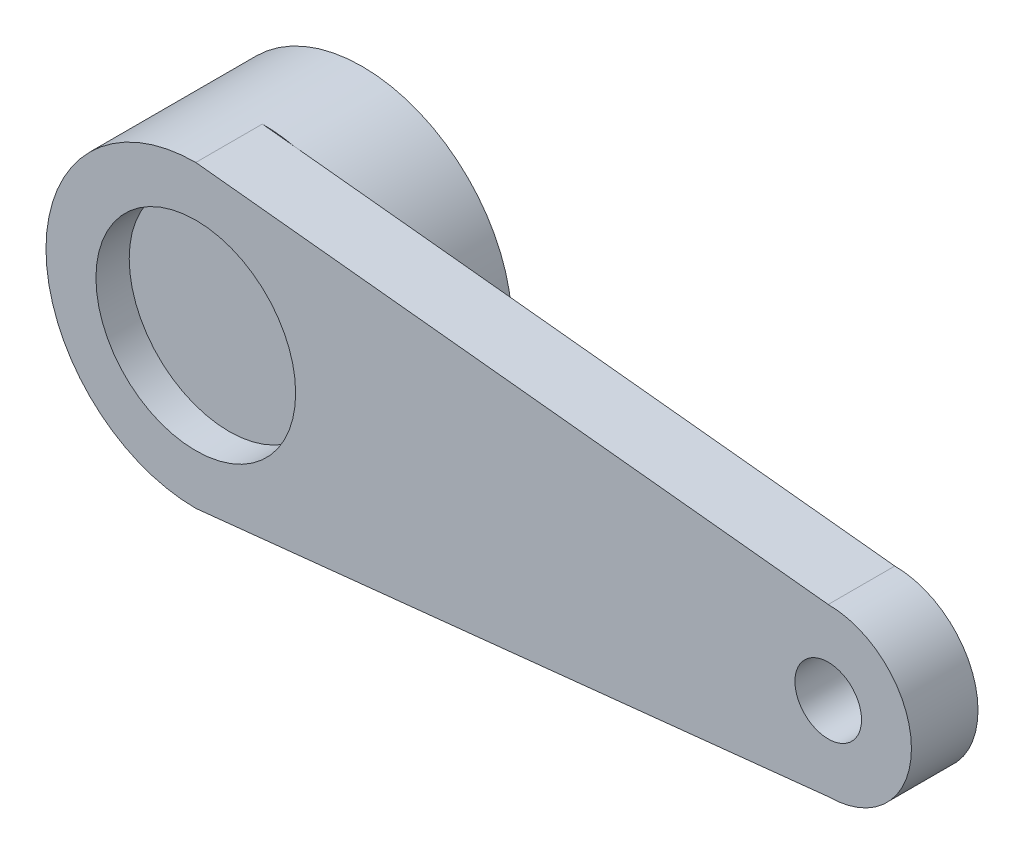
ISO-10303-21;
HEADER;
FILE_DESCRIPTION(('STEP AP214'),'2;1');
FILE_NAME('part.step','',(''),(''),'','','');
FILE_SCHEMA(('AUTOMOTIVE_DESIGN { 1 0 10303 214 1 1 1 1 }'));
ENDSEC;
DATA;
#1=APPLICATION_CONTEXT('core data for automotive mechanical design processes');
#2=APPLICATION_PROTOCOL_DEFINITION('international standard','automotive_design',2000,#1);
#3=PRODUCT_CONTEXT('',#1,'mechanical');
#4=PRODUCT('Part','Part','',(#3));
#5=PRODUCT_RELATED_PRODUCT_CATEGORY('part','',(#4));
#6=PRODUCT_DEFINITION_FORMATION('','',#4);
#7=PRODUCT_DEFINITION_CONTEXT('part definition',#1,'design');
#8=PRODUCT_DEFINITION('design','',#6,#7);
#9=PRODUCT_DEFINITION_SHAPE('','',#8);
#10=(LENGTH_UNIT() NAMED_UNIT(*) SI_UNIT(.MILLI.,.METRE.));
#11=(NAMED_UNIT(*) PLANE_ANGLE_UNIT() SI_UNIT($,.RADIAN.));
#12=(NAMED_UNIT(*) SI_UNIT($,.STERADIAN.) SOLID_ANGLE_UNIT());
#13=UNCERTAINTY_MEASURE_WITH_UNIT(LENGTH_MEASURE(1.E-05),#10,'distance_accuracy_value','');
#14=(GEOMETRIC_REPRESENTATION_CONTEXT(3) GLOBAL_UNCERTAINTY_ASSIGNED_CONTEXT((#13)) GLOBAL_UNIT_ASSIGNED_CONTEXT((#10,
#11,#12)) REPRESENTATION_CONTEXT('',''));
#15=CARTESIAN_POINT('',(0.,0.,0.));
#16=DIRECTION('',(0.,0.,1.));
#17=DIRECTION('',(1.,0.,0.));
#18=AXIS2_PLACEMENT_3D('',#15,#16,#17);
#19=CARTESIAN_POINT('',(0.,0.,0.));
#20=DIRECTION('',(0.,0.,1.));
#21=DIRECTION('',(1.,0.,0.));
#22=AXIS2_PLACEMENT_3D('',#19,#20,#21);
#23=PLANE('',#22);
#24=CARTESIAN_POINT('',(6.4412265758092,2.83219761499148,0.));
#25=DIRECTION('',(0.,0.,1.));
#26=DIRECTION('',(1.,0.,0.));
#27=AXIS2_PLACEMENT_3D('',#24,#25,#26);
#28=CIRCLE('',#27,1.);
#29=CARTESIAN_POINT('',(7.4412265758092,2.83219761499148,0.));
#30=VERTEX_POINT('',#29);
#31=EDGE_CURVE('E45',#30,#30,#28,.T.);
#32=ORIENTED_EDGE('',*,*,#31,.T.);
#33=EDGE_LOOP('',(#32));
#34=FACE_BOUND('',#33,.T.);
#35=CARTESIAN_POINT('',(-12.5587734241908,2.83219761499148,0.));
#36=DIRECTION('',(0.,0.,-1.));
#37=DIRECTION('',(-1.,0.,0.));
#38=AXIS2_PLACEMENT_3D('',#35,#36,#37);
#39=CIRCLE('',#38,4.5);
#40=CARTESIAN_POINT('',(-11.6217871228209,7.23356747800518,0.));
#41=VERTEX_POINT('',#40);
#42=CARTESIAN_POINT('',(-11.6217871228209,-1.56917224802222,0.));
#43=VERTEX_POINT('',#42);
#44=EDGE_CURVE('E11',#41,#43,#39,.T.);
#45=ORIENTED_EDGE('',*,*,#44,.F.);
#46=DIRECTION('',(0.994505452921406,-0.104684784518043,0.));
#47=VECTOR('',#46,1.);
#48=CARTESIAN_POINT('',(0.625721686775104,5.94435602436349,0.));
#49=LINE('',#48,#47);
#50=CARTESIAN_POINT('',(6.4412265758092,5.33219761499148,0.));
#51=VERTEX_POINT('',#50);
#52=EDGE_CURVE('E78',#41,#51,#49,.T.);
#53=ORIENTED_EDGE('',*,*,#52,.T.);
#54=CARTESIAN_POINT('',(6.4412265758092,2.83219761499148,0.));
#55=DIRECTION('',(0.,0.,1.));
#56=DIRECTION('',(1.,0.,0.));
#57=AXIS2_PLACEMENT_3D('',#54,#55,#56);
#58=CIRCLE('',#57,2.5);
#59=CARTESIAN_POINT('',(6.4412265758092,0.332197614991482,0.));
#60=VERTEX_POINT('',#59);
#61=EDGE_CURVE('E118',#60,#51,#58,.T.);
#62=ORIENTED_EDGE('',*,*,#61,.F.);
#63=DIRECTION('',(0.994505452921406,0.104684784518043,0.));
#64=VECTOR('',#63,1.);
#65=CARTESIAN_POINT('',(0.0360038272152343,-0.342036358544726,0.));
#66=LINE('',#65,#64);
#67=EDGE_CURVE('E131',#43,#60,#66,.T.);
#68=ORIENTED_EDGE('',*,*,#67,.F.);
#69=EDGE_LOOP('',(#45,#53,#62,#68));
#70=FACE_BOUND('',#69,.T.);
#71=ADVANCED_FACE('F41',(#34,#70),#23,.F.);
#72=CARTESIAN_POINT('',(0.0360038272152343,-0.342036358544726,2.));
#73=DIRECTION('',(-0.104684784518043,0.994505452921406,0.));
#74=DIRECTION('',(-0.994505452921406,-0.104684784518043,0.));
#75=AXIS2_PLACEMENT_3D('',#72,#73,#74);
#76=PLANE('',#75);
#77=CARTESIAN_POINT('',(-12.5587734241908,-1.66780238500852,0.));
#78=VERTEX_POINT('',#77);
#79=EDGE_CURVE('E132',#78,#43,#66,.T.);
#80=ORIENTED_EDGE('',*,*,#79,.T.);
#81=ORIENTED_EDGE('',*,*,#67,.T.);
#82=DIRECTION('',(0.,0.,-1.));
#83=VECTOR('',#82,1.);
#84=CARTESIAN_POINT('',(6.4412265758092,0.332197614991482,2.));
#85=LINE('',#84,#83);
#86=CARTESIAN_POINT('',(6.4412265758092,0.332197614991482,2.));
#87=VERTEX_POINT('',#86);
#88=EDGE_CURVE('E51',#87,#60,#85,.T.);
#89=ORIENTED_EDGE('',*,*,#88,.F.);
#90=DIRECTION('',(0.994505452921406,0.104684784518043,0.));
#91=VECTOR('',#90,1.);
#92=CARTESIAN_POINT('',(0.0360038272152343,-0.342036358544726,2.));
#93=LINE('',#92,#91);
#94=CARTESIAN_POINT('',(-12.5587734241908,-1.66780238500852,2.));
#95=VERTEX_POINT('',#94);
#96=EDGE_CURVE('E115',#95,#87,#93,.T.);
#97=ORIENTED_EDGE('',*,*,#96,.F.);
#98=DIRECTION('',(0.,0.,-1.));
#99=VECTOR('',#98,1.);
#100=CARTESIAN_POINT('',(-12.5587734241908,-1.66780238500852,2.));
#101=LINE('',#100,#99);
#102=EDGE_CURVE('E112',#95,#78,#101,.T.);
#103=ORIENTED_EDGE('',*,*,#102,.T.);
#104=EDGE_LOOP('',(#80,#81,#89,#97,#103));
#105=FACE_BOUND('',#104,.T.);
#106=ADVANCED_FACE('F43',(#105),#76,.F.);
#107=CARTESIAN_POINT('',(6.4412265758092,2.83219761499148,2.));
#108=DIRECTION('',(0.,0.,-1.));
#109=DIRECTION('',(-1.,0.,0.));
#110=AXIS2_PLACEMENT_3D('',#107,#108,#109);
#111=CYLINDRICAL_SURFACE('',#110,2.5);
#112=ORIENTED_EDGE('',*,*,#61,.T.);
#113=DIRECTION('',(0.,0.,-1.));
#114=VECTOR('',#113,1.);
#115=CARTESIAN_POINT('',(6.4412265758092,5.33219761499148,2.));
#116=LINE('',#115,#114);
#117=CARTESIAN_POINT('',(6.4412265758092,5.33219761499148,2.));
#118=VERTEX_POINT('',#117);
#119=EDGE_CURVE('E111',#118,#51,#116,.T.);
#120=ORIENTED_EDGE('',*,*,#119,.F.);
#121=CARTESIAN_POINT('',(6.4412265758092,2.83219761499148,2.));
#122=DIRECTION('',(0.,0.,1.));
#123=DIRECTION('',(1.,0.,0.));
#124=AXIS2_PLACEMENT_3D('',#121,#122,#123);
#125=CIRCLE('',#124,2.5);
#126=EDGE_CURVE('E91',#87,#118,#125,.T.);
#127=ORIENTED_EDGE('',*,*,#126,.F.);
#128=ORIENTED_EDGE('',*,*,#88,.T.);
#129=EDGE_LOOP('',(#112,#120,#127,#128));
#130=FACE_BOUND('',#129,.T.);
#131=ADVANCED_FACE('F126',(#130),#111,.T.);
#132=CARTESIAN_POINT('',(0.625721686775104,5.94435602436349,2.));
#133=DIRECTION('',(0.104684784518043,0.994505452921406,0.));
#134=DIRECTION('',(-0.994505452921406,0.104684784518043,0.));
#135=AXIS2_PLACEMENT_3D('',#132,#133,#134);
#136=PLANE('',#135);
#137=CARTESIAN_POINT('',(-12.5587734241908,7.33219761499148,0.));
#138=VERTEX_POINT('',#137);
#139=EDGE_CURVE('E104',#138,#41,#49,.T.);
#140=ORIENTED_EDGE('',*,*,#139,.F.);
#141=DIRECTION('',(0.,0.,-1.));
#142=VECTOR('',#141,1.);
#143=CARTESIAN_POINT('',(-12.5587734241908,7.33219761499148,2.));
#144=LINE('',#143,#142);
#145=CARTESIAN_POINT('',(-12.5587734241908,7.33219761499148,2.));
#146=VERTEX_POINT('',#145);
#147=EDGE_CURVE('E106',#146,#138,#144,.T.);
#148=ORIENTED_EDGE('',*,*,#147,.F.);
#149=DIRECTION('',(0.994505452921406,-0.104684784518043,0.));
#150=VECTOR('',#149,1.);
#151=CARTESIAN_POINT('',(0.625721686775104,5.94435602436349,2.));
#152=LINE('',#151,#150);
#153=EDGE_CURVE('E135',#146,#118,#152,.T.);
#154=ORIENTED_EDGE('',*,*,#153,.T.);
#155=ORIENTED_EDGE('',*,*,#119,.T.);
#156=ORIENTED_EDGE('',*,*,#52,.F.);
#157=EDGE_LOOP('',(#140,#148,#154,#155,#156));
#158=FACE_BOUND('',#157,.T.);
#159=ADVANCED_FACE('F114',(#158),#136,.T.);
#160=CARTESIAN_POINT('',(-12.5587734241908,2.83219761499148,2.));
#161=DIRECTION('',(0.,0.,-1.));
#162=DIRECTION('',(-1.,0.,0.));
#163=AXIS2_PLACEMENT_3D('',#160,#161,#162);
#164=CYLINDRICAL_SURFACE('',#163,4.5);
#165=ORIENTED_EDGE('',*,*,#147,.T.);
#166=EDGE_CURVE('E53',#138,#41,#39,.T.);
#167=ORIENTED_EDGE('',*,*,#166,.T.);
#168=ORIENTED_EDGE('',*,*,#44,.T.);
#169=EDGE_CURVE('E54',#43,#78,#39,.T.);
#170=ORIENTED_EDGE('',*,*,#169,.T.);
#171=ORIENTED_EDGE('',*,*,#102,.F.);
#172=CARTESIAN_POINT('',(-12.5587734241908,2.83219761499148,2.));
#173=DIRECTION('',(0.,0.,1.));
#174=DIRECTION('',(1.,0.,0.));
#175=AXIS2_PLACEMENT_3D('',#172,#173,#174);
#176=CIRCLE('',#175,4.5);
#177=EDGE_CURVE('E62',#146,#95,#176,.T.);
#178=ORIENTED_EDGE('',*,*,#177,.F.);
#179=EDGE_LOOP('',(#165,#167,#168,#170,#171,#178));
#180=FACE_BOUND('',#179,.T.);
#181=CARTESIAN_POINT('',(-12.5587734241908,2.83219761499148,-3.));
#182=DIRECTION('',(0.,0.,-1.));
#183=DIRECTION('',(-1.,0.,0.));
#184=AXIS2_PLACEMENT_3D('',#181,#182,#183);
#185=CIRCLE('',#184,4.5);
#186=CARTESIAN_POINT('',(-17.0587734241908,2.83219761499148,-3.));
#187=VERTEX_POINT('',#186);
#188=EDGE_CURVE('E105',#187,#187,#185,.T.);
#189=ORIENTED_EDGE('',*,*,#188,.F.);
#190=EDGE_LOOP('',(#189));
#191=FACE_BOUND('',#190,.T.);
#192=ADVANCED_FACE('F107',(#180,#191),#164,.T.);
#193=CARTESIAN_POINT('',(0.,0.,2.));
#194=DIRECTION('',(0.,0.,1.));
#195=DIRECTION('',(1.,0.,0.));
#196=AXIS2_PLACEMENT_3D('',#193,#194,#195);
#197=PLANE('',#196);
#198=CARTESIAN_POINT('',(-12.5587734241908,2.83219761499148,2.));
#199=DIRECTION('',(0.,0.,1.));
#200=DIRECTION('',(1.,0.,0.));
#201=AXIS2_PLACEMENT_3D('',#198,#199,#200);
#202=CIRCLE('',#201,3.);
#203=CARTESIAN_POINT('',(-9.5587734241908,2.83219761499148,2.));
#204=VERTEX_POINT('',#203);
#205=EDGE_CURVE('E143',#204,#204,#202,.T.);
#206=ORIENTED_EDGE('',*,*,#205,.F.);
#207=EDGE_LOOP('',(#206));
#208=FACE_BOUND('',#207,.T.);
#209=CARTESIAN_POINT('',(6.4412265758092,2.83219761499148,2.));
#210=DIRECTION('',(0.,0.,1.));
#211=DIRECTION('',(1.,0.,0.));
#212=AXIS2_PLACEMENT_3D('',#209,#210,#211);
#213=CIRCLE('',#212,1.);
#214=CARTESIAN_POINT('',(7.4412265758092,2.83219761499148,2.));
#215=VERTEX_POINT('',#214);
#216=EDGE_CURVE('E138',#215,#215,#213,.T.);
#217=ORIENTED_EDGE('',*,*,#216,.F.);
#218=EDGE_LOOP('',(#217));
#219=FACE_BOUND('',#218,.T.);
#220=ORIENTED_EDGE('',*,*,#96,.T.);
#221=ORIENTED_EDGE('',*,*,#126,.T.);
#222=ORIENTED_EDGE('',*,*,#153,.F.);
#223=ORIENTED_EDGE('',*,*,#177,.T.);
#224=EDGE_LOOP('',(#220,#221,#222,#223));
#225=FACE_BOUND('',#224,.T.);
#226=ADVANCED_FACE('F159',(#208,#219,#225),#197,.T.);
#227=CARTESIAN_POINT('',(6.4412265758092,2.83219761499148,-1.));
#228=DIRECTION('',(0.,0.,1.));
#229=DIRECTION('',(1.,0.,0.));
#230=AXIS2_PLACEMENT_3D('',#227,#228,#229);
#231=CYLINDRICAL_SURFACE('',#230,1.);
#232=ORIENTED_EDGE('',*,*,#216,.T.);
#233=EDGE_LOOP('',(#232));
#234=FACE_BOUND('',#233,.T.);
#235=ORIENTED_EDGE('',*,*,#31,.F.);
#236=EDGE_LOOP('',(#235));
#237=FACE_BOUND('',#236,.T.);
#238=ADVANCED_FACE('F162',(#234,#237),#231,.F.);
#239=CARTESIAN_POINT('',(-12.5587734241908,2.83219761499148,0.));
#240=DIRECTION('',(0.,0.,-1.));
#241=DIRECTION('',(-1.,0.,0.));
#242=AXIS2_PLACEMENT_3D('',#239,#240,#241);
#243=PLANE('',#242);
#244=ORIENTED_EDGE('',*,*,#166,.F.);
#245=ORIENTED_EDGE('',*,*,#139,.T.);
#246=EDGE_LOOP('',(#244,#245));
#247=FACE_BOUND('',#246,.T.);
#248=ADVANCED_FACE('F102',(#247),#243,.F.);
#249=CARTESIAN_POINT('',(-12.5587734241908,2.83219761499148,-3.));
#250=DIRECTION('',(0.,0.,-1.));
#251=DIRECTION('',(-1.,0.,0.));
#252=AXIS2_PLACEMENT_3D('',#249,#250,#251);
#253=PLANE('',#252);
#254=ORIENTED_EDGE('',*,*,#188,.T.);
#255=EDGE_LOOP('',(#254));
#256=FACE_BOUND('',#255,.T.);
#257=ADVANCED_FACE('F228',(#256),#253,.T.);
#258=ORIENTED_EDGE('',*,*,#79,.F.);
#259=ORIENTED_EDGE('',*,*,#169,.F.);
#260=EDGE_LOOP('',(#258,#259));
#261=FACE_BOUND('',#260,.T.);
#262=ADVANCED_FACE('F155',(#261),#243,.F.);
#263=CARTESIAN_POINT('',(-12.5587734241908,2.83219761499148,1.));
#264=DIRECTION('',(0.,0.,1.));
#265=DIRECTION('',(1.,0.,0.));
#266=AXIS2_PLACEMENT_3D('',#263,#264,#265);
#267=CYLINDRICAL_SURFACE('',#266,3.);
#268=CARTESIAN_POINT('',(-12.5587734241908,2.83219761499148,1.));
#269=DIRECTION('',(0.,0.,1.));
#270=DIRECTION('',(1.,0.,0.));
#271=AXIS2_PLACEMENT_3D('',#268,#269,#270);
#272=CIRCLE('',#271,3.);
#273=CARTESIAN_POINT('',(-9.5587734241908,2.83219761499148,1.));
#274=VERTEX_POINT('',#273);
#275=EDGE_CURVE('E146',#274,#274,#272,.T.);
#276=ORIENTED_EDGE('',*,*,#275,.F.);
#277=EDGE_LOOP('',(#276));
#278=FACE_BOUND('',#277,.T.);
#279=ORIENTED_EDGE('',*,*,#205,.T.);
#280=EDGE_LOOP('',(#279));
#281=FACE_BOUND('',#280,.T.);
#282=ADVANCED_FACE('F152',(#278,#281),#267,.F.);
#283=CARTESIAN_POINT('',(-12.5587734241908,2.83219761499148,1.));
#284=DIRECTION('',(0.,0.,1.));
#285=DIRECTION('',(1.,0.,0.));
#286=AXIS2_PLACEMENT_3D('',#283,#284,#285);
#287=PLANE('',#286);
#288=ORIENTED_EDGE('',*,*,#275,.T.);
#289=EDGE_LOOP('',(#288));
#290=FACE_BOUND('',#289,.T.);
#291=ADVANCED_FACE('F150',(#290),#287,.T.);
#292=CLOSED_SHELL('',(#71,#106,#131,#159,#192,#226,#238,#248,#257,#262,#282,#291));
#293=MANIFOLD_SOLID_BREP('B2',#292);
#294=ADVANCED_BREP_SHAPE_REPRESENTATION('',(#18,#293),#14);
#295=SHAPE_DEFINITION_REPRESENTATION(#9,#294);
ENDSEC;
END-ISO-10303-21;
